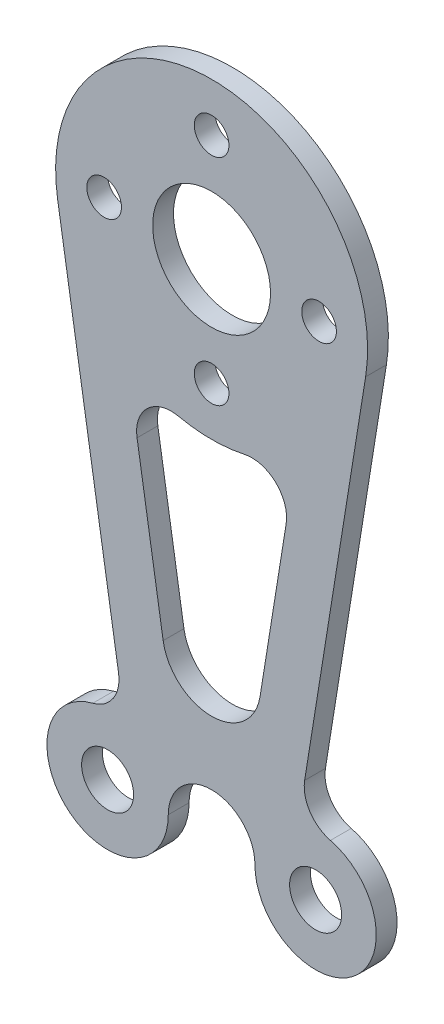
ISO-10303-21;
HEADER;
FILE_DESCRIPTION(('STEP AP214'),'2;1');
FILE_NAME('part.step','',(''),(''),'','','');
FILE_SCHEMA(('AUTOMOTIVE_DESIGN { 1 0 10303 214 1 1 1 1 }'));
ENDSEC;
DATA;
#1=APPLICATION_CONTEXT('core data for automotive mechanical design processes');
#2=APPLICATION_PROTOCOL_DEFINITION('international standard','automotive_design',2000,#1);
#3=PRODUCT_CONTEXT('',#1,'mechanical');
#4=PRODUCT('Part','Part','',(#3));
#5=PRODUCT_RELATED_PRODUCT_CATEGORY('part','',(#4));
#6=PRODUCT_DEFINITION_FORMATION('','',#4);
#7=PRODUCT_DEFINITION_CONTEXT('part definition',#1,'design');
#8=PRODUCT_DEFINITION('design','',#6,#7);
#9=PRODUCT_DEFINITION_SHAPE('','',#8);
#10=(LENGTH_UNIT() NAMED_UNIT(*) SI_UNIT(.MILLI.,.METRE.));
#11=(NAMED_UNIT(*) PLANE_ANGLE_UNIT() SI_UNIT($,.RADIAN.));
#12=(NAMED_UNIT(*) SI_UNIT($,.STERADIAN.) SOLID_ANGLE_UNIT());
#13=UNCERTAINTY_MEASURE_WITH_UNIT(LENGTH_MEASURE(1.E-05),#10,'distance_accuracy_value','');
#14=(GEOMETRIC_REPRESENTATION_CONTEXT(3) GLOBAL_UNCERTAINTY_ASSIGNED_CONTEXT((#13)) GLOBAL_UNIT_ASSIGNED_CONTEXT((#10,
#11,#12)) REPRESENTATION_CONTEXT('',''));
#15=CARTESIAN_POINT('',(0.,0.,0.));
#16=DIRECTION('',(0.,0.,1.));
#17=DIRECTION('',(1.,0.,0.));
#18=AXIS2_PLACEMENT_3D('',#15,#16,#17);
#19=CARTESIAN_POINT('',(0.,0.,1.2));
#20=DIRECTION('',(0.,0.,1.));
#21=DIRECTION('',(1.,0.,0.));
#22=AXIS2_PLACEMENT_3D('',#19,#20,#21);
#23=PLANE('',#22);
#24=CARTESIAN_POINT('',(-6.,-29.,1.2));
#25=DIRECTION('',(0.,0.,1.));
#26=DIRECTION('',(-1.,0.,0.));
#27=AXIS2_PLACEMENT_3D('',#24,#25,#26);
#28=CIRCLE('',#27,1.5);
#29=CARTESIAN_POINT('',(-7.5,-29.,1.2));
#30=VERTEX_POINT('',#29);
#31=EDGE_CURVE('E170',#30,#30,#28,.T.);
#32=ORIENTED_EDGE('',*,*,#31,.F.);
#33=EDGE_LOOP('',(#32));
#34=FACE_BOUND('',#33,.T.);
#35=CARTESIAN_POINT('',(-6.2,0.,1.2));
#36=DIRECTION('',(0.,0.,1.));
#37=DIRECTION('',(1.,0.,0.));
#38=AXIS2_PLACEMENT_3D('',#35,#36,#37);
#39=CIRCLE('',#38,1.00000000000026);
#40=CARTESIAN_POINT('',(-5.19999999999974,0.,1.2));
#41=VERTEX_POINT('',#40);
#42=EDGE_CURVE('E182',#41,#41,#39,.T.);
#43=ORIENTED_EDGE('',*,*,#42,.F.);
#44=EDGE_LOOP('',(#43));
#45=FACE_BOUND('',#44,.T.);
#46=CARTESIAN_POINT('',(6.2,0.,1.2));
#47=DIRECTION('',(0.,0.,1.));
#48=DIRECTION('',(1.,0.,0.));
#49=AXIS2_PLACEMENT_3D('',#46,#47,#48);
#50=CIRCLE('',#49,1.00000000000048);
#51=CARTESIAN_POINT('',(7.20000000000048,0.,1.2));
#52=VERTEX_POINT('',#51);
#53=EDGE_CURVE('E194',#52,#52,#50,.T.);
#54=ORIENTED_EDGE('',*,*,#53,.F.);
#55=EDGE_LOOP('',(#54));
#56=FACE_BOUND('',#55,.T.);
#57=CARTESIAN_POINT('',(0.,0.,1.2));
#58=DIRECTION('',(0.,0.,1.));
#59=DIRECTION('',(1.,0.,0.));
#60=AXIS2_PLACEMENT_3D('',#57,#58,#59);
#61=CIRCLE('',#60,3.4);
#62=CARTESIAN_POINT('',(3.4,0.,1.2));
#63=VERTEX_POINT('',#62);
#64=EDGE_CURVE('E206',#63,#63,#61,.T.);
#65=ORIENTED_EDGE('',*,*,#64,.F.);
#66=EDGE_LOOP('',(#65));
#67=FACE_BOUND('',#66,.T.);
#68=CARTESIAN_POINT('',(0.,0.,1.2));
#69=DIRECTION('',(0.,0.,1.));
#70=DIRECTION('',(1.,0.,0.));
#71=AXIS2_PLACEMENT_3D('',#68,#69,#70);
#72=CIRCLE('',#71,8.99999999999999);
#73=CARTESIAN_POINT('',(8.88632787675764,-1.42589511071468,1.2));
#74=VERTEX_POINT('',#73);
#75=CARTESIAN_POINT('',(-8.88632787675764,-1.42589511071468,1.2));
#76=VERTEX_POINT('',#75);
#77=EDGE_CURVE('E212',#74,#76,#72,.T.);
#78=ORIENTED_EDGE('',*,*,#77,.T.);
#79=DIRECTION('',(0.158432790079409,-0.987369764084182,0.));
#80=VECTOR('',#79,1.);
#81=CARTESIAN_POINT('',(-8.88632787675764,-1.42589511071468,1.2));
#82=LINE('',#81,#80);
#83=CARTESIAN_POINT('',(-5.3684513747081,-23.3496704236723,1.2));
#84=VERTEX_POINT('',#83);
#85=EDGE_CURVE('E215',#76,#84,#82,.T.);
#86=ORIENTED_EDGE('',*,*,#85,.T.);
#87=CARTESIAN_POINT('',(-7.34319090287647,-23.6665360038311,1.2));
#88=DIRECTION('',(0.,0.,1.));
#89=DIRECTION('',(1.,0.,0.));
#90=AXIS2_PLACEMENT_3D('',#87,#88,#89);
#91=CIRCLE('',#90,2.);
#92=CARTESIAN_POINT('',(-6.85475784728502,-25.6059774569834,1.2));
#93=VERTEX_POINT('',#92);
#94=EDGE_CURVE('E11',#84,#93,#91,.F.);
#95=ORIENTED_EDGE('',*,*,#94,.T.);
#96=CARTESIAN_POINT('',(-6.,-29.,1.2));
#97=DIRECTION('',(0.,0.,1.));
#98=DIRECTION('',(-1.,0.,0.));
#99=AXIS2_PLACEMENT_3D('',#96,#97,#98);
#100=CIRCLE('',#99,3.5);
#101=CARTESIAN_POINT('',(-2.5,-29.,1.2));
#102=VERTEX_POINT('',#101);
#103=EDGE_CURVE('E218',#93,#102,#100,.T.);
#104=ORIENTED_EDGE('',*,*,#103,.T.);
#105=CARTESIAN_POINT('',(0.,-29.,1.2));
#106=DIRECTION('',(0.,0.,-1.));
#107=DIRECTION('',(-1.,0.,0.));
#108=AXIS2_PLACEMENT_3D('',#105,#106,#107);
#109=CIRCLE('',#108,2.5);
#110=CARTESIAN_POINT('',(2.5,-29.,1.2));
#111=VERTEX_POINT('',#110);
#112=EDGE_CURVE('E220',#102,#111,#109,.T.);
#113=ORIENTED_EDGE('',*,*,#112,.T.);
#114=CARTESIAN_POINT('',(6.,-29.,1.2));
#115=DIRECTION('',(0.,0.,1.));
#116=DIRECTION('',(1.,0.,0.));
#117=AXIS2_PLACEMENT_3D('',#114,#115,#116);
#118=CIRCLE('',#117,3.5);
#119=CARTESIAN_POINT('',(6.85475784728503,-25.6059774569834,1.2));
#120=VERTEX_POINT('',#119);
#121=EDGE_CURVE('E222',#111,#120,#118,.T.);
#122=ORIENTED_EDGE('',*,*,#121,.T.);
#123=CARTESIAN_POINT('',(7.34319090287647,-23.6665360038311,1.2));
#124=DIRECTION('',(0.,0.,1.));
#125=DIRECTION('',(1.,0.,0.));
#126=AXIS2_PLACEMENT_3D('',#123,#124,#125);
#127=CIRCLE('',#126,2.);
#128=CARTESIAN_POINT('',(5.36845137470811,-23.3496704236723,1.2));
#129=VERTEX_POINT('',#128);
#130=EDGE_CURVE('E279',#120,#129,#127,.F.);
#131=ORIENTED_EDGE('',*,*,#130,.T.);
#132=DIRECTION('',(0.158432790079408,0.987369764084182,0.));
#133=VECTOR('',#132,1.);
#134=CARTESIAN_POINT('',(8.88632787675764,-1.42589511071468,1.2));
#135=LINE('',#134,#133);
#136=EDGE_CURVE('E225',#129,#74,#135,.T.);
#137=ORIENTED_EDGE('',*,*,#136,.T.);
#138=EDGE_LOOP('',(#78,#86,#95,#104,#113,#122,#131,#137));
#139=FACE_BOUND('',#138,.T.);
#140=CARTESIAN_POINT('',(0.,6.2,1.2));
#141=DIRECTION('',(0.,0.,1.));
#142=DIRECTION('',(1.,0.,0.));
#143=AXIS2_PLACEMENT_3D('',#140,#141,#142);
#144=CIRCLE('',#143,1.);
#145=CARTESIAN_POINT('',(1.,6.2,1.2));
#146=VERTEX_POINT('',#145);
#147=EDGE_CURVE('E200',#146,#146,#144,.T.);
#148=ORIENTED_EDGE('',*,*,#147,.F.);
#149=EDGE_LOOP('',(#148));
#150=FACE_BOUND('',#149,.T.);
#151=CARTESIAN_POINT('',(0.,-6.2,1.2));
#152=DIRECTION('',(0.,0.,1.));
#153=DIRECTION('',(1.,0.,0.));
#154=AXIS2_PLACEMENT_3D('',#151,#152,#153);
#155=CIRCLE('',#154,1.00000000000074);
#156=CARTESIAN_POINT('',(1.00000000000074,-6.2,1.2));
#157=VERTEX_POINT('',#156);
#158=EDGE_CURVE('E188',#157,#157,#155,.T.);
#159=ORIENTED_EDGE('',*,*,#158,.F.);
#160=EDGE_LOOP('',(#159));
#161=FACE_BOUND('',#160,.T.);
#162=CARTESIAN_POINT('',(6.,-29.,1.2));
#163=DIRECTION('',(0.,0.,1.));
#164=DIRECTION('',(1.,0.,0.));
#165=AXIS2_PLACEMENT_3D('',#162,#163,#164);
#166=CIRCLE('',#165,1.5);
#167=CARTESIAN_POINT('',(7.50000000000001,-29.,1.2));
#168=VERTEX_POINT('',#167);
#169=EDGE_CURVE('E176',#168,#168,#166,.T.);
#170=ORIENTED_EDGE('',*,*,#169,.F.);
#171=EDGE_LOOP('',(#170));
#172=FACE_BOUND('',#171,.T.);
#173=DIRECTION('',(0.158432790079409,-0.987369764084182,0.));
#174=VECTOR('',#173,1.);
#175=CARTESIAN_POINT('',(-4.86141911905755,-7.57407447473694,1.2));
#176=LINE('',#175,#174);
#177=CARTESIAN_POINT('',(-4.30076558484777,-11.0681261008442,1.2));
#178=VERTEX_POINT('',#177);
#179=CARTESIAN_POINT('',(-2.795583653227,-20.4485777610295,1.2));
#180=VERTEX_POINT('',#179);
#181=EDGE_CURVE('E131',#178,#180,#176,.T.);
#182=ORIENTED_EDGE('',*,*,#181,.F.);
#183=CARTESIAN_POINT('',(-2.32602605667941,-10.7512605206854,1.2));
#184=DIRECTION('',(0.,0.,1.));
#185=DIRECTION('',(1.,0.,0.));
#186=AXIS2_PLACEMENT_3D('',#183,#184,#185);
#187=CIRCLE('',#186,2.);
#188=CARTESIAN_POINT('',(-1.90311222819224,-8.79648588056078,1.2));
#189=VERTEX_POINT('',#188);
#190=EDGE_CURVE('E271',#178,#189,#187,.F.);
#191=ORIENTED_EDGE('',*,*,#190,.T.);
#192=CARTESIAN_POINT('',(0.,0.,1.2));
#193=DIRECTION('',(0.,0.,-1.));
#194=DIRECTION('',(1.,0.,0.));
#195=AXIS2_PLACEMENT_3D('',#192,#193,#194);
#196=CIRCLE('',#195,9.);
#197=CARTESIAN_POINT('',(1.90311222819224,-8.79648588056078,1.2));
#198=VERTEX_POINT('',#197);
#199=EDGE_CURVE('E143',#198,#189,#196,.T.);
#200=ORIENTED_EDGE('',*,*,#199,.F.);
#201=CARTESIAN_POINT('',(2.32602605667941,-10.7512605206854,1.2));
#202=DIRECTION('',(0.,0.,1.));
#203=DIRECTION('',(1.,0.,0.));
#204=AXIS2_PLACEMENT_3D('',#201,#202,#203);
#205=CIRCLE('',#204,2.);
#206=CARTESIAN_POINT('',(4.30076558484777,-11.0681261008442,1.2));
#207=VERTEX_POINT('',#206);
#208=EDGE_CURVE('E275',#198,#207,#205,.F.);
#209=ORIENTED_EDGE('',*,*,#208,.T.);
#210=DIRECTION('',(0.158432790079409,0.987369764084182,0.));
#211=VECTOR('',#210,1.);
#212=CARTESIAN_POINT('',(4.86141911905755,-7.57407447473694,1.2));
#213=LINE('',#212,#211);
#214=CARTESIAN_POINT('',(2.795583653227,-20.4485777610295,1.2));
#215=VERTEX_POINT('',#214);
#216=EDGE_CURVE('E155',#215,#207,#213,.T.);
#217=ORIENTED_EDGE('',*,*,#216,.F.);
#218=CARTESIAN_POINT('',(0.,-20.,1.2));
#219=DIRECTION('',(0.,0.,1.));
#220=DIRECTION('',(1.,0.,0.));
#221=AXIS2_PLACEMENT_3D('',#218,#219,#220);
#222=CIRCLE('',#221,2.83134419841182);
#223=EDGE_CURVE('E142',#180,#215,#222,.T.);
#224=ORIENTED_EDGE('',*,*,#223,.F.);
#225=EDGE_LOOP('',(#182,#191,#200,#209,#217,#224));
#226=FACE_BOUND('',#225,.T.);
#227=ADVANCED_FACE('F32',(#34,#45,#56,#67,#139,#150,#161,#172,#226),#23,.T.);
#228=CARTESIAN_POINT('',(0.,0.,0.));
#229=DIRECTION('',(0.,0.,1.));
#230=DIRECTION('',(1.,0.,0.));
#231=AXIS2_PLACEMENT_3D('',#228,#229,#230);
#232=PLANE('',#231);
#233=CARTESIAN_POINT('',(-6.,-29.,0.));
#234=DIRECTION('',(0.,0.,1.));
#235=DIRECTION('',(-1.,0.,0.));
#236=AXIS2_PLACEMENT_3D('',#233,#234,#235);
#237=CIRCLE('',#236,1.5);
#238=CARTESIAN_POINT('',(-7.5,-29.,0.));
#239=VERTEX_POINT('',#238);
#240=EDGE_CURVE('E151',#239,#239,#237,.T.);
#241=ORIENTED_EDGE('',*,*,#240,.T.);
#242=EDGE_LOOP('',(#241));
#243=FACE_BOUND('',#242,.T.);
#244=CARTESIAN_POINT('',(-6.2,0.,0.));
#245=DIRECTION('',(0.,0.,1.));
#246=DIRECTION('',(1.,0.,0.));
#247=AXIS2_PLACEMENT_3D('',#244,#245,#246);
#248=CIRCLE('',#247,1.00000000000026);
#249=CARTESIAN_POINT('',(-5.19999999999974,0.,0.));
#250=VERTEX_POINT('',#249);
#251=EDGE_CURVE('E179',#250,#250,#248,.T.);
#252=ORIENTED_EDGE('',*,*,#251,.T.);
#253=EDGE_LOOP('',(#252));
#254=FACE_BOUND('',#253,.T.);
#255=CARTESIAN_POINT('',(6.2,0.,0.));
#256=DIRECTION('',(0.,0.,1.));
#257=DIRECTION('',(1.,0.,0.));
#258=AXIS2_PLACEMENT_3D('',#255,#256,#257);
#259=CIRCLE('',#258,1.00000000000048);
#260=CARTESIAN_POINT('',(7.20000000000048,0.,0.));
#261=VERTEX_POINT('',#260);
#262=EDGE_CURVE('E191',#261,#261,#259,.T.);
#263=ORIENTED_EDGE('',*,*,#262,.T.);
#264=EDGE_LOOP('',(#263));
#265=FACE_BOUND('',#264,.T.);
#266=CARTESIAN_POINT('',(0.,0.,0.));
#267=DIRECTION('',(0.,0.,1.));
#268=DIRECTION('',(1.,0.,0.));
#269=AXIS2_PLACEMENT_3D('',#266,#267,#268);
#270=CIRCLE('',#269,3.4);
#271=CARTESIAN_POINT('',(3.4,0.,0.));
#272=VERTEX_POINT('',#271);
#273=EDGE_CURVE('E203',#272,#272,#270,.T.);
#274=ORIENTED_EDGE('',*,*,#273,.T.);
#275=EDGE_LOOP('',(#274));
#276=FACE_BOUND('',#275,.T.);
#277=CARTESIAN_POINT('',(0.,0.,0.));
#278=DIRECTION('',(0.,0.,1.));
#279=DIRECTION('',(1.,0.,0.));
#280=AXIS2_PLACEMENT_3D('',#277,#278,#279);
#281=CIRCLE('',#280,8.99999999999999);
#282=CARTESIAN_POINT('',(8.88632787675764,-1.42589511071468,0.));
#283=VERTEX_POINT('',#282);
#284=CARTESIAN_POINT('',(-8.88632787675764,-1.42589511071468,0.));
#285=VERTEX_POINT('',#284);
#286=EDGE_CURVE('E209',#283,#285,#281,.T.);
#287=ORIENTED_EDGE('',*,*,#286,.F.);
#288=DIRECTION('',(0.158432790079408,0.987369764084182,0.));
#289=VECTOR('',#288,1.);
#290=CARTESIAN_POINT('',(8.88632787675764,-1.42589511071468,0.));
#291=LINE('',#290,#289);
#292=CARTESIAN_POINT('',(5.36845137470811,-23.3496704236723,0.));
#293=VERTEX_POINT('',#292);
#294=EDGE_CURVE('E216',#293,#283,#291,.T.);
#295=ORIENTED_EDGE('',*,*,#294,.F.);
#296=CARTESIAN_POINT('',(7.34319090287647,-23.6665360038311,0.));
#297=DIRECTION('',(0.,0.,1.));
#298=DIRECTION('',(1.,0.,0.));
#299=AXIS2_PLACEMENT_3D('',#296,#297,#298);
#300=CIRCLE('',#299,2.);
#301=CARTESIAN_POINT('',(6.85475784728503,-25.6059774569834,0.));
#302=VERTEX_POINT('',#301);
#303=EDGE_CURVE('E277',#293,#302,#300,.T.);
#304=ORIENTED_EDGE('',*,*,#303,.T.);
#305=CARTESIAN_POINT('',(6.,-29.,0.));
#306=DIRECTION('',(0.,0.,1.));
#307=DIRECTION('',(1.,0.,0.));
#308=AXIS2_PLACEMENT_3D('',#305,#306,#307);
#309=CIRCLE('',#308,3.5);
#310=CARTESIAN_POINT('',(2.5,-29.,0.));
#311=VERTEX_POINT('',#310);
#312=EDGE_CURVE('E236',#311,#302,#309,.T.);
#313=ORIENTED_EDGE('',*,*,#312,.F.);
#314=CARTESIAN_POINT('',(0.,-29.,0.));
#315=DIRECTION('',(0.,0.,-1.));
#316=DIRECTION('',(-1.,0.,0.));
#317=AXIS2_PLACEMENT_3D('',#314,#315,#316);
#318=CIRCLE('',#317,2.5);
#319=CARTESIAN_POINT('',(-2.5,-29.,0.));
#320=VERTEX_POINT('',#319);
#321=EDGE_CURVE('E234',#320,#311,#318,.T.);
#322=ORIENTED_EDGE('',*,*,#321,.F.);
#323=CARTESIAN_POINT('',(-6.,-29.,0.));
#324=DIRECTION('',(0.,0.,1.));
#325=DIRECTION('',(-1.,0.,0.));
#326=AXIS2_PLACEMENT_3D('',#323,#324,#325);
#327=CIRCLE('',#326,3.5);
#328=CARTESIAN_POINT('',(-6.85475784728502,-25.6059774569834,0.));
#329=VERTEX_POINT('',#328);
#330=EDGE_CURVE('E232',#329,#320,#327,.T.);
#331=ORIENTED_EDGE('',*,*,#330,.F.);
#332=CARTESIAN_POINT('',(-7.34319090287647,-23.6665360038311,0.));
#333=DIRECTION('',(0.,0.,1.));
#334=DIRECTION('',(1.,0.,0.));
#335=AXIS2_PLACEMENT_3D('',#332,#333,#334);
#336=CIRCLE('',#335,2.);
#337=CARTESIAN_POINT('',(-5.3684513747081,-23.3496704236723,0.));
#338=VERTEX_POINT('',#337);
#339=EDGE_CURVE('E40',#329,#338,#336,.T.);
#340=ORIENTED_EDGE('',*,*,#339,.T.);
#341=DIRECTION('',(0.158432790079409,-0.987369764084182,0.));
#342=VECTOR('',#341,1.);
#343=CARTESIAN_POINT('',(-8.88632787675764,-1.42589511071468,0.));
#344=LINE('',#343,#342);
#345=EDGE_CURVE('E230',#285,#338,#344,.T.);
#346=ORIENTED_EDGE('',*,*,#345,.F.);
#347=EDGE_LOOP('',(#287,#295,#304,#313,#322,#331,#340,#346));
#348=FACE_BOUND('',#347,.T.);
#349=CARTESIAN_POINT('',(0.,6.2,0.));
#350=DIRECTION('',(0.,0.,1.));
#351=DIRECTION('',(1.,0.,0.));
#352=AXIS2_PLACEMENT_3D('',#349,#350,#351);
#353=CIRCLE('',#352,1.);
#354=CARTESIAN_POINT('',(1.,6.2,0.));
#355=VERTEX_POINT('',#354);
#356=EDGE_CURVE('E197',#355,#355,#353,.T.);
#357=ORIENTED_EDGE('',*,*,#356,.T.);
#358=EDGE_LOOP('',(#357));
#359=FACE_BOUND('',#358,.T.);
#360=CARTESIAN_POINT('',(0.,-6.2,0.));
#361=DIRECTION('',(0.,0.,1.));
#362=DIRECTION('',(1.,0.,0.));
#363=AXIS2_PLACEMENT_3D('',#360,#361,#362);
#364=CIRCLE('',#363,1.00000000000074);
#365=CARTESIAN_POINT('',(1.00000000000074,-6.2,0.));
#366=VERTEX_POINT('',#365);
#367=EDGE_CURVE('E185',#366,#366,#364,.T.);
#368=ORIENTED_EDGE('',*,*,#367,.T.);
#369=EDGE_LOOP('',(#368));
#370=FACE_BOUND('',#369,.T.);
#371=CARTESIAN_POINT('',(6.,-29.,0.));
#372=DIRECTION('',(0.,0.,1.));
#373=DIRECTION('',(1.,0.,0.));
#374=AXIS2_PLACEMENT_3D('',#371,#372,#373);
#375=CIRCLE('',#374,1.5);
#376=CARTESIAN_POINT('',(7.50000000000001,-29.,0.));
#377=VERTEX_POINT('',#376);
#378=EDGE_CURVE('E173',#377,#377,#375,.T.);
#379=ORIENTED_EDGE('',*,*,#378,.T.);
#380=EDGE_LOOP('',(#379));
#381=FACE_BOUND('',#380,.T.);
#382=DIRECTION('',(0.158432790079409,0.987369764084182,0.));
#383=VECTOR('',#382,1.);
#384=CARTESIAN_POINT('',(4.86141911905755,-7.57407447473694,0.));
#385=LINE('',#384,#383);
#386=CARTESIAN_POINT('',(2.795583653227,-20.4485777610295,0.));
#387=VERTEX_POINT('',#386);
#388=CARTESIAN_POINT('',(4.30076558484777,-11.0681261008442,0.));
#389=VERTEX_POINT('',#388);
#390=EDGE_CURVE('E166',#387,#389,#385,.T.);
#391=ORIENTED_EDGE('',*,*,#390,.T.);
#392=CARTESIAN_POINT('',(2.32602605667941,-10.7512605206854,0.));
#393=DIRECTION('',(0.,0.,1.));
#394=DIRECTION('',(1.,0.,0.));
#395=AXIS2_PLACEMENT_3D('',#392,#393,#394);
#396=CIRCLE('',#395,2.);
#397=CARTESIAN_POINT('',(1.90311222819224,-8.79648588056078,0.));
#398=VERTEX_POINT('',#397);
#399=EDGE_CURVE('E273',#389,#398,#396,.T.);
#400=ORIENTED_EDGE('',*,*,#399,.T.);
#401=CARTESIAN_POINT('',(0.,0.,0.));
#402=DIRECTION('',(0.,0.,-1.));
#403=DIRECTION('',(1.,0.,0.));
#404=AXIS2_PLACEMENT_3D('',#401,#402,#403);
#405=CIRCLE('',#404,9.);
#406=CARTESIAN_POINT('',(-1.90311222819224,-8.79648588056078,0.));
#407=VERTEX_POINT('',#406);
#408=EDGE_CURVE('E160',#398,#407,#405,.T.);
#409=ORIENTED_EDGE('',*,*,#408,.T.);
#410=CARTESIAN_POINT('',(-2.32602605667941,-10.7512605206854,0.));
#411=DIRECTION('',(0.,0.,1.));
#412=DIRECTION('',(1.,0.,0.));
#413=AXIS2_PLACEMENT_3D('',#410,#411,#412);
#414=CIRCLE('',#413,2.);
#415=CARTESIAN_POINT('',(-4.30076558484777,-11.0681261008442,0.));
#416=VERTEX_POINT('',#415);
#417=EDGE_CURVE('E269',#407,#416,#414,.T.);
#418=ORIENTED_EDGE('',*,*,#417,.T.);
#419=DIRECTION('',(0.158432790079409,-0.987369764084182,0.));
#420=VECTOR('',#419,1.);
#421=CARTESIAN_POINT('',(-4.86141911905755,-7.57407447473694,0.));
#422=LINE('',#421,#420);
#423=CARTESIAN_POINT('',(-2.795583653227,-20.4485777610295,0.));
#424=VERTEX_POINT('',#423);
#425=EDGE_CURVE('E163',#416,#424,#422,.T.);
#426=ORIENTED_EDGE('',*,*,#425,.T.);
#427=CARTESIAN_POINT('',(0.,-20.,0.));
#428=DIRECTION('',(0.,0.,1.));
#429=DIRECTION('',(1.,0.,0.));
#430=AXIS2_PLACEMENT_3D('',#427,#428,#429);
#431=CIRCLE('',#430,2.83134419841182);
#432=EDGE_CURVE('E150',#424,#387,#431,.T.);
#433=ORIENTED_EDGE('',*,*,#432,.T.);
#434=EDGE_LOOP('',(#391,#400,#409,#418,#426,#433));
#435=FACE_BOUND('',#434,.T.);
#436=ADVANCED_FACE('F296',(#243,#254,#265,#276,#348,#359,#370,#381,#435),#232,.F.);
#437=CARTESIAN_POINT('',(0.,0.,1.2));
#438=DIRECTION('',(0.,0.,-1.));
#439=DIRECTION('',(-1.,0.,0.));
#440=AXIS2_PLACEMENT_3D('',#437,#438,#439);
#441=CYLINDRICAL_SURFACE('',#440,8.99999999999999);
#442=ORIENTED_EDGE('',*,*,#286,.T.);
#443=DIRECTION('',(0.,0.,-1.));
#444=VECTOR('',#443,1.);
#445=CARTESIAN_POINT('',(-8.88632787675764,-1.42589511071468,1.2));
#446=LINE('',#445,#444);
#447=EDGE_CURVE('E248',#76,#285,#446,.T.);
#448=ORIENTED_EDGE('',*,*,#447,.F.);
#449=ORIENTED_EDGE('',*,*,#77,.F.);
#450=DIRECTION('',(0.,0.,-1.));
#451=VECTOR('',#450,1.);
#452=CARTESIAN_POINT('',(8.88632787675764,-1.42589511071468,1.2));
#453=LINE('',#452,#451);
#454=EDGE_CURVE('E227',#74,#283,#453,.T.);
#455=ORIENTED_EDGE('',*,*,#454,.T.);
#456=EDGE_LOOP('',(#442,#448,#449,#455));
#457=FACE_BOUND('',#456,.T.);
#458=ADVANCED_FACE('F315',(#457),#441,.T.);
#459=CARTESIAN_POINT('',(-8.88632787675764,-1.42589511071468,1.2));
#460=DIRECTION('',(0.987369764084182,0.158432790079409,0.));
#461=DIRECTION('',(-0.158432790079409,0.987369764084182,0.));
#462=AXIS2_PLACEMENT_3D('',#459,#460,#461);
#463=PLANE('',#462);
#464=ORIENTED_EDGE('',*,*,#345,.T.);
#465=DIRECTION('',(0.,0.,1.));
#466=VECTOR('',#465,1.);
#467=CARTESIAN_POINT('',(-5.3684513747081,-23.3496704236723,1.2));
#468=LINE('',#467,#466);
#469=EDGE_CURVE('E47',#338,#84,#468,.T.);
#470=ORIENTED_EDGE('',*,*,#469,.T.);
#471=ORIENTED_EDGE('',*,*,#85,.F.);
#472=ORIENTED_EDGE('',*,*,#447,.T.);
#473=EDGE_LOOP('',(#464,#470,#471,#472));
#474=FACE_BOUND('',#473,.T.);
#475=ADVANCED_FACE('F313',(#474),#463,.F.);
#476=CARTESIAN_POINT('',(-6.,-29.,1.2));
#477=DIRECTION('',(0.,0.,-1.));
#478=DIRECTION('',(-1.,0.,0.));
#479=AXIS2_PLACEMENT_3D('',#476,#477,#478);
#480=CYLINDRICAL_SURFACE('',#479,3.5);
#481=ORIENTED_EDGE('',*,*,#103,.F.);
#482=DIRECTION('',(0.,0.,-1.));
#483=VECTOR('',#482,1.);
#484=CARTESIAN_POINT('',(-6.85475784728502,-25.6059774569834,1.2));
#485=LINE('',#484,#483);
#486=EDGE_CURVE('E265',#93,#329,#485,.T.);
#487=ORIENTED_EDGE('',*,*,#486,.T.);
#488=ORIENTED_EDGE('',*,*,#330,.T.);
#489=DIRECTION('',(0.,0.,-1.));
#490=VECTOR('',#489,1.);
#491=CARTESIAN_POINT('',(-2.5,-29.,1.2));
#492=LINE('',#491,#490);
#493=EDGE_CURVE('E245',#102,#320,#492,.T.);
#494=ORIENTED_EDGE('',*,*,#493,.F.);
#495=EDGE_LOOP('',(#481,#487,#488,#494));
#496=FACE_BOUND('',#495,.T.);
#497=ADVANCED_FACE('F308',(#496),#480,.T.);
#498=CARTESIAN_POINT('',(0.,-29.,1.2));
#499=DIRECTION('',(0.,0.,-1.));
#500=DIRECTION('',(-1.,0.,0.));
#501=AXIS2_PLACEMENT_3D('',#498,#499,#500);
#502=CYLINDRICAL_SURFACE('',#501,2.5);
#503=ORIENTED_EDGE('',*,*,#321,.T.);
#504=DIRECTION('',(0.,0.,-1.));
#505=VECTOR('',#504,1.);
#506=CARTESIAN_POINT('',(2.5,-29.,1.2));
#507=LINE('',#506,#505);
#508=EDGE_CURVE('E242',#111,#311,#507,.T.);
#509=ORIENTED_EDGE('',*,*,#508,.F.);
#510=ORIENTED_EDGE('',*,*,#112,.F.);
#511=ORIENTED_EDGE('',*,*,#493,.T.);
#512=EDGE_LOOP('',(#503,#509,#510,#511));
#513=FACE_BOUND('',#512,.T.);
#514=ADVANCED_FACE('F304',(#513),#502,.F.);
#515=CARTESIAN_POINT('',(6.,-29.,1.2));
#516=DIRECTION('',(0.,0.,-1.));
#517=DIRECTION('',(-1.,0.,0.));
#518=AXIS2_PLACEMENT_3D('',#515,#516,#517);
#519=CYLINDRICAL_SURFACE('',#518,3.5);
#520=ORIENTED_EDGE('',*,*,#312,.T.);
#521=DIRECTION('',(0.,0.,-1.));
#522=VECTOR('',#521,1.);
#523=CARTESIAN_POINT('',(6.85475784728503,-25.6059774569834,1.2));
#524=LINE('',#523,#522);
#525=EDGE_CURVE('E263',#302,#120,#524,.F.);
#526=ORIENTED_EDGE('',*,*,#525,.T.);
#527=ORIENTED_EDGE('',*,*,#121,.F.);
#528=ORIENTED_EDGE('',*,*,#508,.T.);
#529=EDGE_LOOP('',(#520,#526,#527,#528));
#530=FACE_BOUND('',#529,.T.);
#531=ADVANCED_FACE('F300',(#530),#519,.T.);
#532=CARTESIAN_POINT('',(8.88632787675764,-1.42589511071468,1.2));
#533=DIRECTION('',(-0.987369764084182,0.158432790079408,0.));
#534=DIRECTION('',(-0.158432790079408,-0.987369764084182,0.));
#535=AXIS2_PLACEMENT_3D('',#532,#533,#534);
#536=PLANE('',#535);
#537=ORIENTED_EDGE('',*,*,#136,.F.);
#538=DIRECTION('',(0.,0.,1.));
#539=VECTOR('',#538,1.);
#540=CARTESIAN_POINT('',(5.36845137470811,-23.3496704236723,0.));
#541=LINE('',#540,#539);
#542=EDGE_CURVE('E260',#129,#293,#541,.F.);
#543=ORIENTED_EDGE('',*,*,#542,.T.);
#544=ORIENTED_EDGE('',*,*,#294,.T.);
#545=ORIENTED_EDGE('',*,*,#454,.F.);
#546=EDGE_LOOP('',(#537,#543,#544,#545));
#547=FACE_BOUND('',#546,.T.);
#548=ADVANCED_FACE('F290',(#547),#536,.F.);
#549=CARTESIAN_POINT('',(0.,0.,1.2));
#550=DIRECTION('',(0.,0.,-1.));
#551=DIRECTION('',(-1.,0.,0.));
#552=AXIS2_PLACEMENT_3D('',#549,#550,#551);
#553=CYLINDRICAL_SURFACE('',#552,3.4);
#554=ORIENTED_EDGE('',*,*,#64,.T.);
#555=EDGE_LOOP('',(#554));
#556=FACE_BOUND('',#555,.T.);
#557=ORIENTED_EDGE('',*,*,#273,.F.);
#558=EDGE_LOOP('',(#557));
#559=FACE_BOUND('',#558,.T.);
#560=ADVANCED_FACE('F334',(#556,#559),#553,.F.);
#561=CARTESIAN_POINT('',(0.,6.2,1.2));
#562=DIRECTION('',(0.,0.,-1.));
#563=DIRECTION('',(-1.,0.,0.));
#564=AXIS2_PLACEMENT_3D('',#561,#562,#563);
#565=CYLINDRICAL_SURFACE('',#564,1.);
#566=ORIENTED_EDGE('',*,*,#147,.T.);
#567=EDGE_LOOP('',(#566));
#568=FACE_BOUND('',#567,.T.);
#569=ORIENTED_EDGE('',*,*,#356,.F.);
#570=EDGE_LOOP('',(#569));
#571=FACE_BOUND('',#570,.T.);
#572=ADVANCED_FACE('F367',(#568,#571),#565,.F.);
#573=CARTESIAN_POINT('',(6.2,0.,1.2));
#574=DIRECTION('',(0.,0.,-1.));
#575=DIRECTION('',(-1.,0.,0.));
#576=AXIS2_PLACEMENT_3D('',#573,#574,#575);
#577=CYLINDRICAL_SURFACE('',#576,1.00000000000048);
#578=ORIENTED_EDGE('',*,*,#53,.T.);
#579=EDGE_LOOP('',(#578));
#580=FACE_BOUND('',#579,.T.);
#581=ORIENTED_EDGE('',*,*,#262,.F.);
#582=EDGE_LOOP('',(#581));
#583=FACE_BOUND('',#582,.T.);
#584=ADVANCED_FACE('F374',(#580,#583),#577,.F.);
#585=CARTESIAN_POINT('',(0.,-6.2,1.2));
#586=DIRECTION('',(0.,0.,-1.));
#587=DIRECTION('',(-1.,0.,0.));
#588=AXIS2_PLACEMENT_3D('',#585,#586,#587);
#589=CYLINDRICAL_SURFACE('',#588,1.00000000000074);
#590=ORIENTED_EDGE('',*,*,#158,.T.);
#591=EDGE_LOOP('',(#590));
#592=FACE_BOUND('',#591,.T.);
#593=ORIENTED_EDGE('',*,*,#367,.F.);
#594=EDGE_LOOP('',(#593));
#595=FACE_BOUND('',#594,.T.);
#596=ADVANCED_FACE('F381',(#592,#595),#589,.F.);
#597=CARTESIAN_POINT('',(-6.2,0.,1.2));
#598=DIRECTION('',(0.,0.,-1.));
#599=DIRECTION('',(-1.,0.,0.));
#600=AXIS2_PLACEMENT_3D('',#597,#598,#599);
#601=CYLINDRICAL_SURFACE('',#600,1.00000000000026);
#602=ORIENTED_EDGE('',*,*,#42,.T.);
#603=EDGE_LOOP('',(#602));
#604=FACE_BOUND('',#603,.T.);
#605=ORIENTED_EDGE('',*,*,#251,.F.);
#606=EDGE_LOOP('',(#605));
#607=FACE_BOUND('',#606,.T.);
#608=ADVANCED_FACE('F389',(#604,#607),#601,.F.);
#609=CARTESIAN_POINT('',(6.,-29.,1.2));
#610=DIRECTION('',(0.,0.,-1.));
#611=DIRECTION('',(-1.,0.,0.));
#612=AXIS2_PLACEMENT_3D('',#609,#610,#611);
#613=CYLINDRICAL_SURFACE('',#612,1.5);
#614=ORIENTED_EDGE('',*,*,#169,.T.);
#615=EDGE_LOOP('',(#614));
#616=FACE_BOUND('',#615,.T.);
#617=ORIENTED_EDGE('',*,*,#378,.F.);
#618=EDGE_LOOP('',(#617));
#619=FACE_BOUND('',#618,.T.);
#620=ADVANCED_FACE('F397',(#616,#619),#613,.F.);
#621=CARTESIAN_POINT('',(-6.,-29.,1.2));
#622=DIRECTION('',(0.,0.,-1.));
#623=DIRECTION('',(-1.,0.,0.));
#624=AXIS2_PLACEMENT_3D('',#621,#622,#623);
#625=CYLINDRICAL_SURFACE('',#624,1.5);
#626=ORIENTED_EDGE('',*,*,#31,.T.);
#627=EDGE_LOOP('',(#626));
#628=FACE_BOUND('',#627,.T.);
#629=ORIENTED_EDGE('',*,*,#240,.F.);
#630=EDGE_LOOP('',(#629));
#631=FACE_BOUND('',#630,.T.);
#632=ADVANCED_FACE('F405',(#628,#631),#625,.F.);
#633=CARTESIAN_POINT('',(0.,0.,1.2));
#634=DIRECTION('',(0.,0.,-1.));
#635=DIRECTION('',(-1.,0.,0.));
#636=AXIS2_PLACEMENT_3D('',#633,#634,#635);
#637=CYLINDRICAL_SURFACE('',#636,9.);
#638=ORIENTED_EDGE('',*,*,#199,.T.);
#639=DIRECTION('',(0.,0.,-1.));
#640=VECTOR('',#639,1.);
#641=CARTESIAN_POINT('',(-1.90311222819224,-8.79648588056078,1.2));
#642=LINE('',#641,#640);
#643=EDGE_CURVE('E253',#189,#407,#642,.T.);
#644=ORIENTED_EDGE('',*,*,#643,.T.);
#645=ORIENTED_EDGE('',*,*,#408,.F.);
#646=DIRECTION('',(0.,0.,-1.));
#647=VECTOR('',#646,1.);
#648=CARTESIAN_POINT('',(1.90311222819224,-8.79648588056078,1.2));
#649=LINE('',#648,#647);
#650=EDGE_CURVE('E251',#398,#198,#649,.F.);
#651=ORIENTED_EDGE('',*,*,#650,.T.);
#652=EDGE_LOOP('',(#638,#644,#645,#651));
#653=FACE_BOUND('',#652,.T.);
#654=ADVANCED_FACE('F413',(#653),#637,.T.);
#655=CARTESIAN_POINT('',(-4.86141911905755,-7.57407447473694,1.2));
#656=DIRECTION('',(0.987369764084182,0.158432790079409,0.));
#657=DIRECTION('',(-0.158432790079409,0.987369764084182,0.));
#658=AXIS2_PLACEMENT_3D('',#655,#656,#657);
#659=PLANE('',#658);
#660=ORIENTED_EDGE('',*,*,#425,.F.);
#661=DIRECTION('',(0.,0.,1.));
#662=VECTOR('',#661,1.);
#663=CARTESIAN_POINT('',(-4.30076558484777,-11.0681261008442,1.2));
#664=LINE('',#663,#662);
#665=EDGE_CURVE('E138',#416,#178,#664,.T.);
#666=ORIENTED_EDGE('',*,*,#665,.T.);
#667=ORIENTED_EDGE('',*,*,#181,.T.);
#668=DIRECTION('',(0.,0.,-1.));
#669=VECTOR('',#668,1.);
#670=CARTESIAN_POINT('',(-2.795583653227,-20.4485777610295,1.2));
#671=LINE('',#670,#669);
#672=EDGE_CURVE('E135',#180,#424,#671,.T.);
#673=ORIENTED_EDGE('',*,*,#672,.T.);
#674=EDGE_LOOP('',(#660,#666,#667,#673));
#675=FACE_BOUND('',#674,.T.);
#676=ADVANCED_FACE('F134',(#675),#659,.T.);
#677=CARTESIAN_POINT('',(0.,-20.,1.2));
#678=DIRECTION('',(0.,0.,-1.));
#679=DIRECTION('',(-1.,0.,0.));
#680=AXIS2_PLACEMENT_3D('',#677,#678,#679);
#681=CYLINDRICAL_SURFACE('',#680,2.83134419841182);
#682=ORIENTED_EDGE('',*,*,#432,.F.);
#683=ORIENTED_EDGE('',*,*,#672,.F.);
#684=ORIENTED_EDGE('',*,*,#223,.T.);
#685=DIRECTION('',(0.,0.,-1.));
#686=VECTOR('',#685,1.);
#687=CARTESIAN_POINT('',(2.795583653227,-20.4485777610295,1.2));
#688=LINE('',#687,#686);
#689=EDGE_CURVE('E152',#215,#387,#688,.T.);
#690=ORIENTED_EDGE('',*,*,#689,.T.);
#691=EDGE_LOOP('',(#682,#683,#684,#690));
#692=FACE_BOUND('',#691,.T.);
#693=ADVANCED_FACE('F147',(#692),#681,.F.);
#694=CARTESIAN_POINT('',(4.86141911905755,-7.57407447473694,1.2));
#695=DIRECTION('',(-0.987369764084182,0.158432790079409,0.));
#696=DIRECTION('',(-0.158432790079409,-0.987369764084182,0.));
#697=AXIS2_PLACEMENT_3D('',#694,#695,#696);
#698=PLANE('',#697);
#699=ORIENTED_EDGE('',*,*,#216,.T.);
#700=DIRECTION('',(0.,0.,1.));
#701=VECTOR('',#700,1.);
#702=CARTESIAN_POINT('',(4.30076558484777,-11.0681261008442,0.));
#703=LINE('',#702,#701);
#704=EDGE_CURVE('E257',#207,#389,#703,.F.);
#705=ORIENTED_EDGE('',*,*,#704,.T.);
#706=ORIENTED_EDGE('',*,*,#390,.F.);
#707=ORIENTED_EDGE('',*,*,#689,.F.);
#708=EDGE_LOOP('',(#699,#705,#706,#707));
#709=FACE_BOUND('',#708,.T.);
#710=ADVANCED_FACE('F434',(#709),#698,.T.);
#711=CARTESIAN_POINT('',(-2.32602605667941,-10.7512605206854,1.2));
#712=DIRECTION('',(0.,0.,-1.));
#713=DIRECTION('',(-1.,0.,0.));
#714=AXIS2_PLACEMENT_3D('',#711,#712,#713);
#715=CYLINDRICAL_SURFACE('',#714,2.);
#716=ORIENTED_EDGE('',*,*,#190,.F.);
#717=ORIENTED_EDGE('',*,*,#665,.F.);
#718=ORIENTED_EDGE('',*,*,#417,.F.);
#719=ORIENTED_EDGE('',*,*,#643,.F.);
#720=EDGE_LOOP('',(#716,#717,#718,#719));
#721=FACE_BOUND('',#720,.T.);
#722=ADVANCED_FACE('F440',(#721),#715,.F.);
#723=CARTESIAN_POINT('',(2.32602605667941,-10.7512605206854,1.2));
#724=DIRECTION('',(0.,0.,-1.));
#725=DIRECTION('',(-1.,0.,0.));
#726=AXIS2_PLACEMENT_3D('',#723,#724,#725);
#727=CYLINDRICAL_SURFACE('',#726,2.);
#728=ORIENTED_EDGE('',*,*,#208,.F.);
#729=ORIENTED_EDGE('',*,*,#650,.F.);
#730=ORIENTED_EDGE('',*,*,#399,.F.);
#731=ORIENTED_EDGE('',*,*,#704,.F.);
#732=EDGE_LOOP('',(#728,#729,#730,#731));
#733=FACE_BOUND('',#732,.T.);
#734=ADVANCED_FACE('F448',(#733),#727,.F.);
#735=CARTESIAN_POINT('',(7.34319090287647,-23.6665360038311,1.2));
#736=DIRECTION('',(0.,0.,-1.));
#737=DIRECTION('',(-1.,0.,0.));
#738=AXIS2_PLACEMENT_3D('',#735,#736,#737);
#739=CYLINDRICAL_SURFACE('',#738,2.);
#740=ORIENTED_EDGE('',*,*,#130,.F.);
#741=ORIENTED_EDGE('',*,*,#525,.F.);
#742=ORIENTED_EDGE('',*,*,#303,.F.);
#743=ORIENTED_EDGE('',*,*,#542,.F.);
#744=EDGE_LOOP('',(#740,#741,#742,#743));
#745=FACE_BOUND('',#744,.T.);
#746=ADVANCED_FACE('F293',(#745),#739,.F.);
#747=CARTESIAN_POINT('',(-7.34319090287647,-23.6665360038311,1.2));
#748=DIRECTION('',(0.,0.,-1.));
#749=DIRECTION('',(-1.,0.,0.));
#750=AXIS2_PLACEMENT_3D('',#747,#748,#749);
#751=CYLINDRICAL_SURFACE('',#750,2.);
#752=ORIENTED_EDGE('',*,*,#94,.F.);
#753=ORIENTED_EDGE('',*,*,#469,.F.);
#754=ORIENTED_EDGE('',*,*,#339,.F.);
#755=ORIENTED_EDGE('',*,*,#486,.F.);
#756=EDGE_LOOP('',(#752,#753,#754,#755));
#757=FACE_BOUND('',#756,.T.);
#758=ADVANCED_FACE('F34',(#757),#751,.F.);
#759=CLOSED_SHELL('',(#227,#436,#458,#475,#497,#514,#531,#548,#560,#572,#584,#596,#608,#620,
#632,#654,#676,#693,#710,#722,#734,#746,#758));
#760=MANIFOLD_SOLID_BREP('B2',#759);
#761=ADVANCED_BREP_SHAPE_REPRESENTATION('',(#18,#760),#14);
#762=SHAPE_DEFINITION_REPRESENTATION(#9,#761);
ENDSEC;
END-ISO-10303-21;
